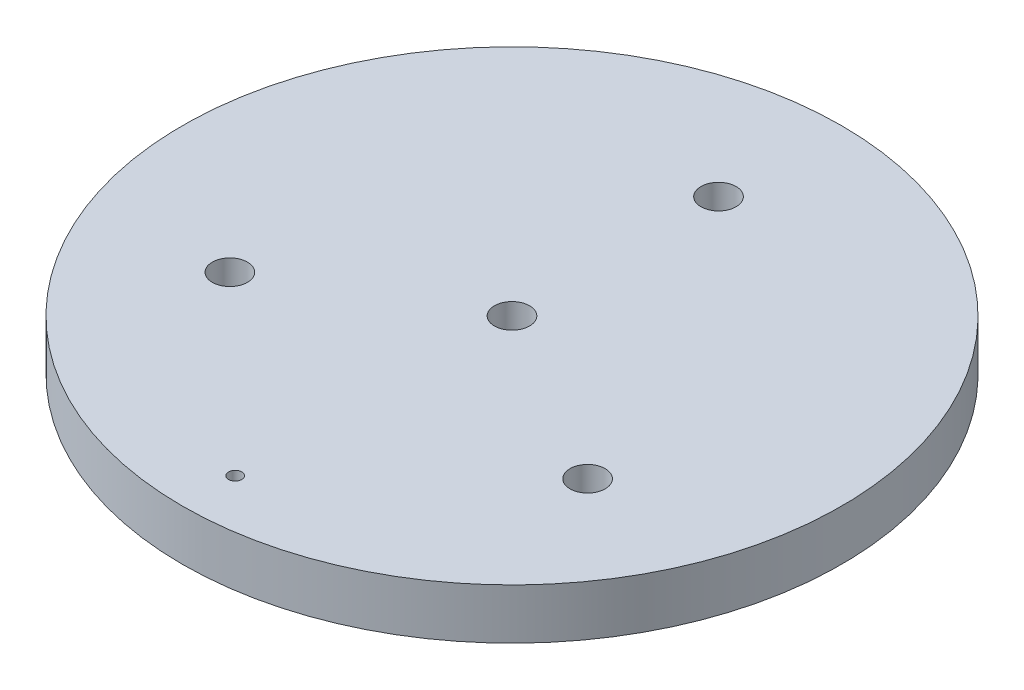
ISO-10303-21;
HEADER;
FILE_DESCRIPTION(('STEP AP214'),'2;1');
FILE_NAME('part.step','',(''),(''),'','','');
FILE_SCHEMA(('AUTOMOTIVE_DESIGN { 1 0 10303 214 1 1 1 1 }'));
ENDSEC;
DATA;
#1=APPLICATION_CONTEXT('core data for automotive mechanical design processes');
#2=APPLICATION_PROTOCOL_DEFINITION('international standard','automotive_design',2000,#1);
#3=PRODUCT_CONTEXT('',#1,'mechanical');
#4=PRODUCT('Part','Part','',(#3));
#5=PRODUCT_RELATED_PRODUCT_CATEGORY('part','',(#4));
#6=PRODUCT_DEFINITION_FORMATION('','',#4);
#7=PRODUCT_DEFINITION_CONTEXT('part definition',#1,'design');
#8=PRODUCT_DEFINITION('design','',#6,#7);
#9=PRODUCT_DEFINITION_SHAPE('','',#8);
#10=(LENGTH_UNIT() NAMED_UNIT(*) SI_UNIT(.MILLI.,.METRE.));
#11=(NAMED_UNIT(*) PLANE_ANGLE_UNIT() SI_UNIT($,.RADIAN.));
#12=(NAMED_UNIT(*) SI_UNIT($,.STERADIAN.) SOLID_ANGLE_UNIT());
#13=UNCERTAINTY_MEASURE_WITH_UNIT(LENGTH_MEASURE(1.E-05),#10,'distance_accuracy_value','');
#14=(GEOMETRIC_REPRESENTATION_CONTEXT(3) GLOBAL_UNCERTAINTY_ASSIGNED_CONTEXT((#13)) GLOBAL_UNIT_ASSIGNED_CONTEXT((#10,
#11,#12)) REPRESENTATION_CONTEXT('',''));
#15=CARTESIAN_POINT('',(0.,0.,0.));
#16=DIRECTION('',(0.,0.,1.));
#17=DIRECTION('',(1.,0.,0.));
#18=AXIS2_PLACEMENT_3D('',#15,#16,#17);
#19=CARTESIAN_POINT('',(0.,11.482,0.));
#20=DIRECTION('',(0.,-1.,0.));
#21=DIRECTION('',(0.,0.,-1.));
#22=AXIS2_PLACEMENT_3D('',#19,#20,#21);
#23=CYLINDRICAL_SURFACE('',#22,75.);
#24=CARTESIAN_POINT('',(0.,11.482,0.));
#25=DIRECTION('',(0.,1.,0.));
#26=DIRECTION('',(0.,0.,1.));
#27=AXIS2_PLACEMENT_3D('',#24,#25,#26);
#28=CIRCLE('',#27,75.);
#29=CARTESIAN_POINT('',(0.,11.482,75.));
#30=VERTEX_POINT('',#29);
#31=EDGE_CURVE('E10',#30,#30,#28,.T.);
#32=ORIENTED_EDGE('',*,*,#31,.F.);
#33=EDGE_LOOP('',(#32));
#34=FACE_BOUND('',#33,.T.);
#35=CARTESIAN_POINT('',(0.,0.,0.));
#36=DIRECTION('',(0.,1.,0.));
#37=DIRECTION('',(0.,0.,1.));
#38=AXIS2_PLACEMENT_3D('',#35,#36,#37);
#39=CIRCLE('',#38,75.);
#40=CARTESIAN_POINT('',(0.,0.,75.));
#41=VERTEX_POINT('',#40);
#42=EDGE_CURVE('E40',#41,#41,#39,.T.);
#43=ORIENTED_EDGE('',*,*,#42,.T.);
#44=EDGE_LOOP('',(#43));
#45=FACE_BOUND('',#44,.T.);
#46=ADVANCED_FACE('F37',(#34,#45),#23,.T.);
#47=CARTESIAN_POINT('',(0.,11.482,0.));
#48=DIRECTION('',(0.,1.,0.));
#49=DIRECTION('',(0.,0.,1.));
#50=AXIS2_PLACEMENT_3D('',#47,#48,#49);
#51=PLANE('',#50);
#52=CARTESIAN_POINT('',(0.,11.482,0.));
#53=DIRECTION('',(0.,1.,0.));
#54=DIRECTION('',(0.,0.,1.));
#55=AXIS2_PLACEMENT_3D('',#52,#53,#54);
#56=CIRCLE('',#55,4.);
#57=CARTESIAN_POINT('',(0.,11.482,4.));
#58=VERTEX_POINT('',#57);
#59=EDGE_CURVE('E80',#58,#58,#56,.T.);
#60=ORIENTED_EDGE('',*,*,#59,.F.);
#61=EDGE_LOOP('',(#60));
#62=FACE_BOUND('',#61,.T.);
#63=CARTESIAN_POINT('',(0.,11.482,63.));
#64=DIRECTION('',(0.,1.,0.));
#65=DIRECTION('',(0.,0.,1.));
#66=AXIS2_PLACEMENT_3D('',#63,#64,#65);
#67=CIRCLE('',#66,1.5);
#68=CARTESIAN_POINT('',(0.,11.482,64.5));
#69=VERTEX_POINT('',#68);
#70=EDGE_CURVE('E73',#69,#69,#67,.T.);
#71=ORIENTED_EDGE('',*,*,#70,.F.);
#72=EDGE_LOOP('',(#71));
#73=FACE_BOUND('',#72,.T.);
#74=CARTESIAN_POINT('',(-40.7031939778688,11.482,23.4999999999996));
#75=DIRECTION('',(0.,1.,0.));
#76=DIRECTION('',(0.866025403784443,0.,-0.499999999999992));
#77=AXIS2_PLACEMENT_3D('',#74,#75,#76);
#78=CIRCLE('',#77,4.);
#79=CARTESIAN_POINT('',(-37.2390923627311,11.482,21.4999999999997));
#80=VERTEX_POINT('',#79);
#81=EDGE_CURVE('E65',#80,#80,#78,.T.);
#82=ORIENTED_EDGE('',*,*,#81,.F.);
#83=EDGE_LOOP('',(#82));
#84=FACE_BOUND('',#83,.T.);
#85=CARTESIAN_POINT('',(40.7031939778685,11.482,23.5000000000002));
#86=DIRECTION('',(0.,1.,0.));
#87=DIRECTION('',(-0.866025403784436,0.,-0.500000000000004));
#88=AXIS2_PLACEMENT_3D('',#85,#86,#87);
#89=CIRCLE('',#88,4.);
#90=CARTESIAN_POINT('',(37.2390923627308,11.482,21.5000000000002));
#91=VERTEX_POINT('',#90);
#92=EDGE_CURVE('E59',#91,#91,#89,.T.);
#93=ORIENTED_EDGE('',*,*,#92,.F.);
#94=EDGE_LOOP('',(#93));
#95=FACE_BOUND('',#94,.T.);
#96=CARTESIAN_POINT('',(0.,11.482,-47.));
#97=DIRECTION('',(0.,1.,0.));
#98=DIRECTION('',(0.,0.,1.));
#99=AXIS2_PLACEMENT_3D('',#96,#97,#98);
#100=CIRCLE('',#99,4.);
#101=CARTESIAN_POINT('',(0.,11.482,-43.));
#102=VERTEX_POINT('',#101);
#103=EDGE_CURVE('E52',#102,#102,#100,.T.);
#104=ORIENTED_EDGE('',*,*,#103,.F.);
#105=EDGE_LOOP('',(#104));
#106=FACE_BOUND('',#105,.T.);
#107=ORIENTED_EDGE('',*,*,#31,.T.);
#108=EDGE_LOOP('',(#107));
#109=FACE_BOUND('',#108,.T.);
#110=ADVANCED_FACE('F97',(#62,#73,#84,#95,#106,#109),#51,.T.);
#111=CARTESIAN_POINT('',(0.,0.,0.));
#112=DIRECTION('',(0.,1.,0.));
#113=DIRECTION('',(0.,0.,1.));
#114=AXIS2_PLACEMENT_3D('',#111,#112,#113);
#115=PLANE('',#114);
#116=CARTESIAN_POINT('',(0.,0.,0.));
#117=DIRECTION('',(0.,1.,0.));
#118=DIRECTION('',(0.,0.,1.));
#119=AXIS2_PLACEMENT_3D('',#116,#117,#118);
#120=CIRCLE('',#119,4.);
#121=CARTESIAN_POINT('',(0.,0.,4.));
#122=VERTEX_POINT('',#121);
#123=EDGE_CURVE('E76',#122,#122,#120,.T.);
#124=ORIENTED_EDGE('',*,*,#123,.T.);
#125=EDGE_LOOP('',(#124));
#126=FACE_BOUND('',#125,.T.);
#127=CARTESIAN_POINT('',(0.,0.,63.));
#128=DIRECTION('',(0.,1.,0.));
#129=DIRECTION('',(0.,0.,1.));
#130=AXIS2_PLACEMENT_3D('',#127,#128,#129);
#131=CIRCLE('',#130,1.5);
#132=CARTESIAN_POINT('',(0.,0.,64.5));
#133=VERTEX_POINT('',#132);
#134=EDGE_CURVE('E69',#133,#133,#131,.T.);
#135=ORIENTED_EDGE('',*,*,#134,.T.);
#136=EDGE_LOOP('',(#135));
#137=FACE_BOUND('',#136,.T.);
#138=CARTESIAN_POINT('',(-40.7031939778688,0.,23.4999999999996));
#139=DIRECTION('',(0.,1.,0.));
#140=DIRECTION('',(0.866025403784443,0.,-0.499999999999992));
#141=AXIS2_PLACEMENT_3D('',#138,#139,#140);
#142=CIRCLE('',#141,4.);
#143=CARTESIAN_POINT('',(-37.2390923627311,0.,21.4999999999997));
#144=VERTEX_POINT('',#143);
#145=EDGE_CURVE('E62',#144,#144,#142,.T.);
#146=ORIENTED_EDGE('',*,*,#145,.T.);
#147=EDGE_LOOP('',(#146));
#148=FACE_BOUND('',#147,.T.);
#149=CARTESIAN_POINT('',(40.7031939778685,0.,23.5000000000002));
#150=DIRECTION('',(0.,1.,0.));
#151=DIRECTION('',(-0.866025403784436,0.,-0.500000000000004));
#152=AXIS2_PLACEMENT_3D('',#149,#150,#151);
#153=CIRCLE('',#152,4.);
#154=CARTESIAN_POINT('',(37.2390923627308,0.,21.5000000000002));
#155=VERTEX_POINT('',#154);
#156=EDGE_CURVE('E56',#155,#155,#153,.T.);
#157=ORIENTED_EDGE('',*,*,#156,.T.);
#158=EDGE_LOOP('',(#157));
#159=FACE_BOUND('',#158,.T.);
#160=CARTESIAN_POINT('',(0.,0.,-47.));
#161=DIRECTION('',(0.,1.,0.));
#162=DIRECTION('',(0.,0.,1.));
#163=AXIS2_PLACEMENT_3D('',#160,#161,#162);
#164=CIRCLE('',#163,4.);
#165=CARTESIAN_POINT('',(0.,0.,-43.));
#166=VERTEX_POINT('',#165);
#167=EDGE_CURVE('E50',#166,#166,#164,.T.);
#168=ORIENTED_EDGE('',*,*,#167,.T.);
#169=EDGE_LOOP('',(#168));
#170=FACE_BOUND('',#169,.T.);
#171=ORIENTED_EDGE('',*,*,#42,.F.);
#172=EDGE_LOOP('',(#171));
#173=FACE_BOUND('',#172,.T.);
#174=ADVANCED_FACE('F87',(#126,#137,#148,#159,#170,#173),#115,.F.);
#175=CARTESIAN_POINT('',(0.,0.,-47.));
#176=DIRECTION('',(0.,1.,0.));
#177=DIRECTION('',(0.,0.,1.));
#178=AXIS2_PLACEMENT_3D('',#175,#176,#177);
#179=CYLINDRICAL_SURFACE('',#178,4.);
#180=ORIENTED_EDGE('',*,*,#167,.F.);
#181=EDGE_LOOP('',(#180));
#182=FACE_BOUND('',#181,.T.);
#183=ORIENTED_EDGE('',*,*,#103,.T.);
#184=EDGE_LOOP('',(#183));
#185=FACE_BOUND('',#184,.T.);
#186=ADVANCED_FACE('F109',(#182,#185),#179,.F.);
#187=CARTESIAN_POINT('',(40.7031939778685,0.,23.5000000000002));
#188=DIRECTION('',(0.,1.,0.));
#189=DIRECTION('',(0.,0.,1.));
#190=AXIS2_PLACEMENT_3D('',#187,#188,#189);
#191=CYLINDRICAL_SURFACE('',#190,4.);
#192=ORIENTED_EDGE('',*,*,#156,.F.);
#193=EDGE_LOOP('',(#192));
#194=FACE_BOUND('',#193,.T.);
#195=ORIENTED_EDGE('',*,*,#92,.T.);
#196=EDGE_LOOP('',(#195));
#197=FACE_BOUND('',#196,.T.);
#198=ADVANCED_FACE('F111',(#194,#197),#191,.F.);
#199=CARTESIAN_POINT('',(-40.7031939778688,0.,23.4999999999996));
#200=DIRECTION('',(0.,1.,0.));
#201=DIRECTION('',(0.,0.,1.));
#202=AXIS2_PLACEMENT_3D('',#199,#200,#201);
#203=CYLINDRICAL_SURFACE('',#202,4.);
#204=ORIENTED_EDGE('',*,*,#145,.F.);
#205=EDGE_LOOP('',(#204));
#206=FACE_BOUND('',#205,.T.);
#207=ORIENTED_EDGE('',*,*,#81,.T.);
#208=EDGE_LOOP('',(#207));
#209=FACE_BOUND('',#208,.T.);
#210=ADVANCED_FACE('F118',(#206,#209),#203,.F.);
#211=CARTESIAN_POINT('',(0.,0.,63.));
#212=DIRECTION('',(0.,1.,0.));
#213=DIRECTION('',(0.,0.,1.));
#214=AXIS2_PLACEMENT_3D('',#211,#212,#213);
#215=CYLINDRICAL_SURFACE('',#214,1.5);
#216=ORIENTED_EDGE('',*,*,#134,.F.);
#217=EDGE_LOOP('',(#216));
#218=FACE_BOUND('',#217,.T.);
#219=ORIENTED_EDGE('',*,*,#70,.T.);
#220=EDGE_LOOP('',(#219));
#221=FACE_BOUND('',#220,.T.);
#222=ADVANCED_FACE('F93',(#218,#221),#215,.F.);
#223=CARTESIAN_POINT('',(0.,0.,0.));
#224=DIRECTION('',(0.,1.,0.));
#225=DIRECTION('',(0.,0.,1.));
#226=AXIS2_PLACEMENT_3D('',#223,#224,#225);
#227=CYLINDRICAL_SURFACE('',#226,4.);
#228=ORIENTED_EDGE('',*,*,#123,.F.);
#229=EDGE_LOOP('',(#228));
#230=FACE_BOUND('',#229,.T.);
#231=ORIENTED_EDGE('',*,*,#59,.T.);
#232=EDGE_LOOP('',(#231));
#233=FACE_BOUND('',#232,.T.);
#234=ADVANCED_FACE('F90',(#230,#233),#227,.F.);
#235=CLOSED_SHELL('',(#46,#110,#174,#186,#198,#210,#222,#234));
#236=MANIFOLD_SOLID_BREP('B2',#235);
#237=ADVANCED_BREP_SHAPE_REPRESENTATION('',(#18,#236),#14);
#238=SHAPE_DEFINITION_REPRESENTATION(#9,#237);
ENDSEC;
END-ISO-10303-21;
